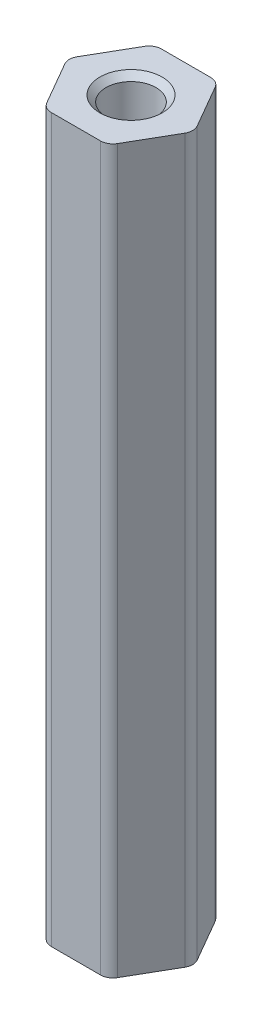
ISO-10303-21;
HEADER;
FILE_DESCRIPTION(('STEP AP214'),'2;1');
FILE_NAME('part.step','',(''),(''),'','','');
FILE_SCHEMA(('AUTOMOTIVE_DESIGN { 1 0 10303 214 1 1 1 1 }'));
ENDSEC;
DATA;
#1=APPLICATION_CONTEXT('core data for automotive mechanical design processes');
#2=APPLICATION_PROTOCOL_DEFINITION('international standard','automotive_design',2000,#1);
#3=PRODUCT_CONTEXT('',#1,'mechanical');
#4=PRODUCT('Part','Part','',(#3));
#5=PRODUCT_RELATED_PRODUCT_CATEGORY('part','',(#4));
#6=PRODUCT_DEFINITION_FORMATION('','',#4);
#7=PRODUCT_DEFINITION_CONTEXT('part definition',#1,'design');
#8=PRODUCT_DEFINITION('design','',#6,#7);
#9=PRODUCT_DEFINITION_SHAPE('','',#8);
#10=(LENGTH_UNIT() NAMED_UNIT(*) SI_UNIT(.MILLI.,.METRE.));
#11=(NAMED_UNIT(*) PLANE_ANGLE_UNIT() SI_UNIT($,.RADIAN.));
#12=(NAMED_UNIT(*) SI_UNIT($,.STERADIAN.) SOLID_ANGLE_UNIT());
#13=UNCERTAINTY_MEASURE_WITH_UNIT(LENGTH_MEASURE(1.E-05),#10,'distance_accuracy_value','');
#14=(GEOMETRIC_REPRESENTATION_CONTEXT(3) GLOBAL_UNCERTAINTY_ASSIGNED_CONTEXT((#13)) GLOBAL_UNIT_ASSIGNED_CONTEXT((#10,
#11,#12)) REPRESENTATION_CONTEXT('',''));
#15=CARTESIAN_POINT('',(0.,0.,0.));
#16=DIRECTION('',(0.,0.,1.));
#17=DIRECTION('',(1.,0.,0.));
#18=AXIS2_PLACEMENT_3D('',#15,#16,#17);
#19=CARTESIAN_POINT('',(-2.6035,29.591,0.));
#20=DIRECTION('',(-0.866025403784438,0.,-0.500000000000001));
#21=DIRECTION('',(-0.500000000000001,0.,0.866025403784438));
#22=AXIS2_PLACEMENT_3D('',#19,#20,#21);
#23=PLANE('',#22);
#24=DIRECTION('',(0.500000000000001,0.,-0.866025403784438));
#25=VECTOR('',#24,1.);
#26=CARTESIAN_POINT('',(-2.6035,0.,0.));
#27=LINE('',#26,#25);
#28=CARTESIAN_POINT('',(-2.45685303162583,0.,-0.254000000000001));
#29=VERTEX_POINT('',#28);
#30=CARTESIAN_POINT('',(-1.44839696837416,0.,-2.00069713875279));
#31=VERTEX_POINT('',#30);
#32=EDGE_CURVE('E215',#29,#31,#27,.T.);
#33=ORIENTED_EDGE('',*,*,#32,.F.);
#34=DIRECTION('',(0.,-1.,0.));
#35=VECTOR('',#34,1.);
#36=CARTESIAN_POINT('',(-2.45685303162583,29.591,-0.254000000000001));
#37=LINE('',#36,#35);
#38=CARTESIAN_POINT('',(-2.45685303162583,29.591,-0.254000000000001));
#39=VERTEX_POINT('',#38);
#40=EDGE_CURVE('E170',#29,#39,#37,.F.);
#41=ORIENTED_EDGE('',*,*,#40,.T.);
#42=DIRECTION('',(0.500000000000001,0.,-0.866025403784438));
#43=VECTOR('',#42,1.);
#44=CARTESIAN_POINT('',(-2.6035,29.591,0.));
#45=LINE('',#44,#43);
#46=CARTESIAN_POINT('',(-1.44839696837416,29.591,-2.00069713875279));
#47=VERTEX_POINT('',#46);
#48=EDGE_CURVE('E147',#39,#47,#45,.T.);
#49=ORIENTED_EDGE('',*,*,#48,.T.);
#50=DIRECTION('',(0.,-1.,0.));
#51=VECTOR('',#50,1.);
#52=CARTESIAN_POINT('',(-1.44839696837416,29.591,-2.00069713875279));
#53=LINE('',#52,#51);
#54=EDGE_CURVE('E167',#47,#31,#53,.T.);
#55=ORIENTED_EDGE('',*,*,#54,.T.);
#56=EDGE_LOOP('',(#33,#41,#49,#55));
#57=FACE_BOUND('',#56,.T.);
#58=ADVANCED_FACE('F36',(#57),#23,.T.);
#59=CARTESIAN_POINT('',(-1.30174999999999,29.591,2.25469713875279));
#60=DIRECTION('',(-0.866025403784438,0.,0.500000000000001));
#61=DIRECTION('',(0.500000000000001,0.,0.866025403784438));
#62=AXIS2_PLACEMENT_3D('',#59,#60,#61);
#63=PLANE('',#62);
#64=DIRECTION('',(-0.500000000000001,0.,-0.866025403784438));
#65=VECTOR('',#64,1.);
#66=CARTESIAN_POINT('',(-1.30174999999999,29.591,2.25469713875279));
#67=LINE('',#66,#65);
#68=CARTESIAN_POINT('',(-1.44839696837416,29.591,2.00069713875279));
#69=VERTEX_POINT('',#68);
#70=CARTESIAN_POINT('',(-2.45685303162583,29.591,0.254));
#71=VERTEX_POINT('',#70);
#72=EDGE_CURVE('E152',#69,#71,#67,.T.);
#73=ORIENTED_EDGE('',*,*,#72,.T.);
#74=DIRECTION('',(0.,-1.,0.));
#75=VECTOR('',#74,1.);
#76=CARTESIAN_POINT('',(-2.45685303162583,29.591,0.254));
#77=LINE('',#76,#75);
#78=CARTESIAN_POINT('',(-2.45685303162583,0.,0.254));
#79=VERTEX_POINT('',#78);
#80=EDGE_CURVE('E146',#71,#79,#77,.T.);
#81=ORIENTED_EDGE('',*,*,#80,.T.);
#82=DIRECTION('',(-0.500000000000001,0.,-0.866025403784438));
#83=VECTOR('',#82,1.);
#84=CARTESIAN_POINT('',(-1.30174999999999,0.,2.25469713875279));
#85=LINE('',#84,#83);
#86=CARTESIAN_POINT('',(-1.44839696837416,0.,2.00069713875279));
#87=VERTEX_POINT('',#86);
#88=EDGE_CURVE('E129',#87,#79,#85,.T.);
#89=ORIENTED_EDGE('',*,*,#88,.F.);
#90=DIRECTION('',(0.,-1.,0.));
#91=VECTOR('',#90,1.);
#92=CARTESIAN_POINT('',(-1.44839696837416,29.591,2.00069713875279));
#93=LINE('',#92,#91);
#94=EDGE_CURVE('E143',#87,#69,#93,.F.);
#95=ORIENTED_EDGE('',*,*,#94,.T.);
#96=EDGE_LOOP('',(#73,#81,#89,#95));
#97=FACE_BOUND('',#96,.T.);
#98=ADVANCED_FACE('F142',(#97),#63,.T.);
#99=CARTESIAN_POINT('',(1.30175,29.591,2.25469713875279));
#100=DIRECTION('',(0.,0.,1.));
#101=DIRECTION('',(1.,0.,0.));
#102=AXIS2_PLACEMENT_3D('',#99,#100,#101);
#103=PLANE('',#102);
#104=DIRECTION('',(-1.,0.,0.));
#105=VECTOR('',#104,1.);
#106=CARTESIAN_POINT('',(1.30175,29.591,2.25469713875279));
#107=LINE('',#106,#105);
#108=CARTESIAN_POINT('',(1.00845606325167,29.591,2.25469713875279));
#109=VERTEX_POINT('',#108);
#110=CARTESIAN_POINT('',(-1.00845606325166,29.591,2.25469713875279));
#111=VERTEX_POINT('',#110);
#112=EDGE_CURVE('E156',#109,#111,#107,.T.);
#113=ORIENTED_EDGE('',*,*,#112,.T.);
#114=DIRECTION('',(0.,-1.,0.));
#115=VECTOR('',#114,1.);
#116=CARTESIAN_POINT('',(-1.00845606325166,29.591,2.25469713875279));
#117=LINE('',#116,#115);
#118=CARTESIAN_POINT('',(-1.00845606325166,0.,2.25469713875279));
#119=VERTEX_POINT('',#118);
#120=EDGE_CURVE('E184',#111,#119,#117,.T.);
#121=ORIENTED_EDGE('',*,*,#120,.T.);
#122=DIRECTION('',(-1.,0.,0.));
#123=VECTOR('',#122,1.);
#124=CARTESIAN_POINT('',(1.30175,0.,2.25469713875279));
#125=LINE('',#124,#123);
#126=CARTESIAN_POINT('',(1.00845606325167,0.,2.25469713875279));
#127=VERTEX_POINT('',#126);
#128=EDGE_CURVE('E131',#127,#119,#125,.T.);
#129=ORIENTED_EDGE('',*,*,#128,.F.);
#130=DIRECTION('',(0.,-1.,0.));
#131=VECTOR('',#130,1.);
#132=CARTESIAN_POINT('',(1.00845606325167,29.591,2.25469713875279));
#133=LINE('',#132,#131);
#134=EDGE_CURVE('E182',#127,#109,#133,.F.);
#135=ORIENTED_EDGE('',*,*,#134,.T.);
#136=EDGE_LOOP('',(#113,#121,#129,#135));
#137=FACE_BOUND('',#136,.T.);
#138=ADVANCED_FACE('F269',(#137),#103,.T.);
#139=CARTESIAN_POINT('',(2.6035,29.591,0.));
#140=DIRECTION('',(0.866025403784438,0.,0.500000000000001));
#141=DIRECTION('',(0.500000000000001,0.,-0.866025403784438));
#142=AXIS2_PLACEMENT_3D('',#139,#140,#141);
#143=PLANE('',#142);
#144=DIRECTION('',(-0.500000000000001,0.,0.866025403784438));
#145=VECTOR('',#144,1.);
#146=CARTESIAN_POINT('',(2.6035,0.,0.));
#147=LINE('',#146,#145);
#148=CARTESIAN_POINT('',(2.45685303162583,0.,0.254000000000001));
#149=VERTEX_POINT('',#148);
#150=CARTESIAN_POINT('',(1.44839696837416,0.,2.00069713875279));
#151=VERTEX_POINT('',#150);
#152=EDGE_CURVE('E201',#149,#151,#147,.T.);
#153=ORIENTED_EDGE('',*,*,#152,.F.);
#154=DIRECTION('',(0.,-1.,0.));
#155=VECTOR('',#154,1.);
#156=CARTESIAN_POINT('',(2.45685303162583,29.591,0.254000000000001));
#157=LINE('',#156,#155);
#158=CARTESIAN_POINT('',(2.45685303162583,29.591,0.254000000000001));
#159=VERTEX_POINT('',#158);
#160=EDGE_CURVE('E11',#149,#159,#157,.F.);
#161=ORIENTED_EDGE('',*,*,#160,.T.);
#162=DIRECTION('',(-0.500000000000001,0.,0.866025403784438));
#163=VECTOR('',#162,1.);
#164=CARTESIAN_POINT('',(2.6035,29.591,0.));
#165=LINE('',#164,#163);
#166=CARTESIAN_POINT('',(1.44839696837416,29.591,2.00069713875279));
#167=VERTEX_POINT('',#166);
#168=EDGE_CURVE('E204',#159,#167,#165,.T.);
#169=ORIENTED_EDGE('',*,*,#168,.T.);
#170=DIRECTION('',(0.,-1.,0.));
#171=VECTOR('',#170,1.);
#172=CARTESIAN_POINT('',(1.44839696837416,29.591,2.00069713875279));
#173=LINE('',#172,#171);
#174=EDGE_CURVE('E44',#167,#151,#173,.T.);
#175=ORIENTED_EDGE('',*,*,#174,.T.);
#176=EDGE_LOOP('',(#153,#161,#169,#175));
#177=FACE_BOUND('',#176,.T.);
#178=ADVANCED_FACE('F200',(#177),#143,.T.);
#179=CARTESIAN_POINT('',(1.30174999999999,29.591,-2.25469713875279));
#180=DIRECTION('',(0.866025403784438,0.,-0.500000000000001));
#181=DIRECTION('',(-0.500000000000001,0.,-0.866025403784438));
#182=AXIS2_PLACEMENT_3D('',#179,#180,#181);
#183=PLANE('',#182);
#184=DIRECTION('',(0.500000000000001,0.,0.866025403784438));
#185=VECTOR('',#184,1.);
#186=CARTESIAN_POINT('',(1.30174999999999,0.,-2.25469713875279));
#187=LINE('',#186,#185);
#188=CARTESIAN_POINT('',(1.44839696837416,0.,-2.00069713875279));
#189=VERTEX_POINT('',#188);
#190=CARTESIAN_POINT('',(2.45685303162583,0.,-0.254));
#191=VERTEX_POINT('',#190);
#192=EDGE_CURVE('E208',#189,#191,#187,.T.);
#193=ORIENTED_EDGE('',*,*,#192,.F.);
#194=DIRECTION('',(0.,-1.,0.));
#195=VECTOR('',#194,1.);
#196=CARTESIAN_POINT('',(1.44839696837416,29.591,-2.00069713875279));
#197=LINE('',#196,#195);
#198=CARTESIAN_POINT('',(1.44839696837416,29.591,-2.00069713875279));
#199=VERTEX_POINT('',#198);
#200=EDGE_CURVE('E193',#189,#199,#197,.F.);
#201=ORIENTED_EDGE('',*,*,#200,.T.);
#202=DIRECTION('',(0.500000000000001,0.,0.866025403784438));
#203=VECTOR('',#202,1.);
#204=CARTESIAN_POINT('',(1.30174999999999,29.591,-2.25469713875279));
#205=LINE('',#204,#203);
#206=CARTESIAN_POINT('',(2.45685303162583,29.591,-0.254));
#207=VERTEX_POINT('',#206);
#208=EDGE_CURVE('E222',#199,#207,#205,.T.);
#209=ORIENTED_EDGE('',*,*,#208,.T.);
#210=DIRECTION('',(0.,-1.,0.));
#211=VECTOR('',#210,1.);
#212=CARTESIAN_POINT('',(2.45685303162583,29.591,-0.254));
#213=LINE('',#212,#211);
#214=EDGE_CURVE('E190',#207,#191,#213,.T.);
#215=ORIENTED_EDGE('',*,*,#214,.T.);
#216=EDGE_LOOP('',(#193,#201,#209,#215));
#217=FACE_BOUND('',#216,.T.);
#218=ADVANCED_FACE('F261',(#217),#183,.T.);
#219=CARTESIAN_POINT('',(-1.30175,29.591,-2.25469713875279));
#220=DIRECTION('',(0.,0.,-1.));
#221=DIRECTION('',(-1.,0.,0.));
#222=AXIS2_PLACEMENT_3D('',#219,#220,#221);
#223=PLANE('',#222);
#224=DIRECTION('',(1.,0.,0.));
#225=VECTOR('',#224,1.);
#226=CARTESIAN_POINT('',(-1.30175,0.,-2.25469713875279));
#227=LINE('',#226,#225);
#228=CARTESIAN_POINT('',(-1.00845606325167,0.,-2.25469713875279));
#229=VERTEX_POINT('',#228);
#230=CARTESIAN_POINT('',(1.00845606325166,0.,-2.25469713875279));
#231=VERTEX_POINT('',#230);
#232=EDGE_CURVE('E210',#229,#231,#227,.T.);
#233=ORIENTED_EDGE('',*,*,#232,.F.);
#234=DIRECTION('',(0.,-1.,0.));
#235=VECTOR('',#234,1.);
#236=CARTESIAN_POINT('',(-1.00845606325167,29.591,-2.25469713875279));
#237=LINE('',#236,#235);
#238=CARTESIAN_POINT('',(-1.00845606325167,29.591,-2.25469713875279));
#239=VERTEX_POINT('',#238);
#240=EDGE_CURVE('E58',#229,#239,#237,.F.);
#241=ORIENTED_EDGE('',*,*,#240,.T.);
#242=DIRECTION('',(1.,0.,0.));
#243=VECTOR('',#242,1.);
#244=CARTESIAN_POINT('',(-1.30175,29.591,-2.25469713875279));
#245=LINE('',#244,#243);
#246=CARTESIAN_POINT('',(1.00845606325166,29.591,-2.25469713875279));
#247=VERTEX_POINT('',#246);
#248=EDGE_CURVE('E225',#239,#247,#245,.T.);
#249=ORIENTED_EDGE('',*,*,#248,.T.);
#250=DIRECTION('',(0.,-1.,0.));
#251=VECTOR('',#250,1.);
#252=CARTESIAN_POINT('',(1.00845606325166,29.591,-2.25469713875279));
#253=LINE('',#252,#251);
#254=EDGE_CURVE('E186',#247,#231,#253,.T.);
#255=ORIENTED_EDGE('',*,*,#254,.T.);
#256=EDGE_LOOP('',(#233,#241,#249,#255));
#257=FACE_BOUND('',#256,.T.);
#258=ADVANCED_FACE('F242',(#257),#223,.T.);
#259=CARTESIAN_POINT('',(0.,29.591,0.));
#260=DIRECTION('',(0.,-1.,0.));
#261=DIRECTION('',(0.,0.,-1.));
#262=AXIS2_PLACEMENT_3D('',#259,#260,#261);
#263=PLANE('',#262);
#264=CARTESIAN_POINT('',(0.,29.591,0.));
#265=DIRECTION('',(0.,1.,0.));
#266=DIRECTION('',(0.,0.,1.));
#267=AXIS2_PLACEMENT_3D('',#264,#265,#266);
#268=CIRCLE('',#267,1.275);
#269=CARTESIAN_POINT('',(0.,29.591,1.275));
#270=VERTEX_POINT('',#269);
#271=EDGE_CURVE('E234',#270,#270,#268,.T.);
#272=ORIENTED_EDGE('',*,*,#271,.F.);
#273=EDGE_LOOP('',(#272));
#274=FACE_BOUND('',#273,.T.);
#275=ORIENTED_EDGE('',*,*,#48,.F.);
#276=CARTESIAN_POINT('',(-2.01691212650334,29.591,0.));
#277=DIRECTION('',(0.,-1.,0.));
#278=DIRECTION('',(0.,0.,-1.));
#279=AXIS2_PLACEMENT_3D('',#276,#277,#278);
#280=CIRCLE('',#279,0.508);
#281=EDGE_CURVE('E180',#39,#71,#280,.F.);
#282=ORIENTED_EDGE('',*,*,#281,.T.);
#283=ORIENTED_EDGE('',*,*,#72,.F.);
#284=CARTESIAN_POINT('',(-1.00845606325166,29.591,1.74669713875279));
#285=DIRECTION('',(0.,-1.,0.));
#286=DIRECTION('',(0.,0.,-1.));
#287=AXIS2_PLACEMENT_3D('',#284,#285,#286);
#288=CIRCLE('',#287,0.508);
#289=EDGE_CURVE('E151',#69,#111,#288,.F.);
#290=ORIENTED_EDGE('',*,*,#289,.T.);
#291=ORIENTED_EDGE('',*,*,#112,.F.);
#292=CARTESIAN_POINT('',(1.00845606325167,29.591,1.74669713875279));
#293=DIRECTION('',(0.,-1.,0.));
#294=DIRECTION('',(0.,0.,-1.));
#295=AXIS2_PLACEMENT_3D('',#292,#293,#294);
#296=CIRCLE('',#295,0.508);
#297=EDGE_CURVE('E172',#109,#167,#296,.F.);
#298=ORIENTED_EDGE('',*,*,#297,.T.);
#299=ORIENTED_EDGE('',*,*,#168,.F.);
#300=CARTESIAN_POINT('',(2.01691212650334,29.591,0.));
#301=DIRECTION('',(0.,-1.,0.));
#302=DIRECTION('',(0.,0.,-1.));
#303=AXIS2_PLACEMENT_3D('',#300,#301,#302);
#304=CIRCLE('',#303,0.508);
#305=EDGE_CURVE('E174',#159,#207,#304,.F.);
#306=ORIENTED_EDGE('',*,*,#305,.T.);
#307=ORIENTED_EDGE('',*,*,#208,.F.);
#308=CARTESIAN_POINT('',(1.00845606325166,29.591,-1.74669713875279));
#309=DIRECTION('',(0.,-1.,0.));
#310=DIRECTION('',(0.,0.,-1.));
#311=AXIS2_PLACEMENT_3D('',#308,#309,#310);
#312=CIRCLE('',#311,0.508);
#313=EDGE_CURVE('E51',#199,#247,#312,.F.);
#314=ORIENTED_EDGE('',*,*,#313,.T.);
#315=ORIENTED_EDGE('',*,*,#248,.F.);
#316=CARTESIAN_POINT('',(-1.00845606325167,29.591,-1.74669713875279));
#317=DIRECTION('',(0.,-1.,0.));
#318=DIRECTION('',(0.,0.,-1.));
#319=AXIS2_PLACEMENT_3D('',#316,#317,#318);
#320=CIRCLE('',#319,0.508);
#321=EDGE_CURVE('E177',#239,#47,#320,.F.);
#322=ORIENTED_EDGE('',*,*,#321,.T.);
#323=EDGE_LOOP('',(#275,#282,#283,#290,#291,#298,#299,#306,#307,#314,#315,#322));
#324=FACE_BOUND('',#323,.T.);
#325=ADVANCED_FACE('F240',(#274,#324),#263,.F.);
#326=CARTESIAN_POINT('',(0.,0.,0.));
#327=DIRECTION('',(0.,-1.,0.));
#328=DIRECTION('',(0.,0.,-1.));
#329=AXIS2_PLACEMENT_3D('',#326,#327,#328);
#330=PLANE('',#329);
#331=CARTESIAN_POINT('',(0.,0.,0.));
#332=DIRECTION('',(0.,1.,0.));
#333=DIRECTION('',(0.,0.,1.));
#334=AXIS2_PLACEMENT_3D('',#331,#332,#333);
#335=CIRCLE('',#334,1.02499999999999);
#336=CARTESIAN_POINT('',(0.,0.,1.02499999999999));
#337=VERTEX_POINT('',#336);
#338=EDGE_CURVE('E217',#337,#337,#335,.T.);
#339=ORIENTED_EDGE('',*,*,#338,.T.);
#340=EDGE_LOOP('',(#339));
#341=FACE_BOUND('',#340,.T.);
#342=ORIENTED_EDGE('',*,*,#88,.T.);
#343=CARTESIAN_POINT('',(-2.01691212650334,0.,0.));
#344=DIRECTION('',(0.,-1.,0.));
#345=DIRECTION('',(0.,0.,-1.));
#346=AXIS2_PLACEMENT_3D('',#343,#344,#345);
#347=CIRCLE('',#346,0.508);
#348=EDGE_CURVE('E136',#79,#29,#347,.T.);
#349=ORIENTED_EDGE('',*,*,#348,.T.);
#350=ORIENTED_EDGE('',*,*,#32,.T.);
#351=CARTESIAN_POINT('',(-1.00845606325167,0.,-1.74669713875279));
#352=DIRECTION('',(0.,-1.,0.));
#353=DIRECTION('',(0.,0.,-1.));
#354=AXIS2_PLACEMENT_3D('',#351,#352,#353);
#355=CIRCLE('',#354,0.508);
#356=EDGE_CURVE('E137',#31,#229,#355,.T.);
#357=ORIENTED_EDGE('',*,*,#356,.T.);
#358=ORIENTED_EDGE('',*,*,#232,.T.);
#359=CARTESIAN_POINT('',(1.00845606325166,0.,-1.74669713875279));
#360=DIRECTION('',(0.,-1.,0.));
#361=DIRECTION('',(0.,0.,-1.));
#362=AXIS2_PLACEMENT_3D('',#359,#360,#361);
#363=CIRCLE('',#362,0.508);
#364=EDGE_CURVE('E163',#231,#189,#363,.T.);
#365=ORIENTED_EDGE('',*,*,#364,.T.);
#366=ORIENTED_EDGE('',*,*,#192,.T.);
#367=CARTESIAN_POINT('',(2.01691212650334,0.,0.));
#368=DIRECTION('',(0.,-1.,0.));
#369=DIRECTION('',(0.,0.,-1.));
#370=AXIS2_PLACEMENT_3D('',#367,#368,#369);
#371=CIRCLE('',#370,0.508);
#372=EDGE_CURVE('E161',#191,#149,#371,.T.);
#373=ORIENTED_EDGE('',*,*,#372,.T.);
#374=ORIENTED_EDGE('',*,*,#152,.T.);
#375=CARTESIAN_POINT('',(1.00845606325167,0.,1.74669713875279));
#376=DIRECTION('',(0.,-1.,0.));
#377=DIRECTION('',(0.,0.,-1.));
#378=AXIS2_PLACEMENT_3D('',#375,#376,#377);
#379=CIRCLE('',#378,0.508);
#380=EDGE_CURVE('E154',#151,#127,#379,.T.);
#381=ORIENTED_EDGE('',*,*,#380,.T.);
#382=ORIENTED_EDGE('',*,*,#128,.T.);
#383=CARTESIAN_POINT('',(-1.00845606325166,0.,1.74669713875279));
#384=DIRECTION('',(0.,-1.,0.));
#385=DIRECTION('',(0.,0.,-1.));
#386=AXIS2_PLACEMENT_3D('',#383,#384,#385);
#387=CIRCLE('',#386,0.508);
#388=EDGE_CURVE('E126',#119,#87,#387,.T.);
#389=ORIENTED_EDGE('',*,*,#388,.T.);
#390=EDGE_LOOP('',(#342,#349,#350,#357,#358,#365,#366,#373,#374,#381,#382,#389));
#391=FACE_BOUND('',#390,.T.);
#392=ADVANCED_FACE('F128',(#341,#391),#330,.T.);
#393=CARTESIAN_POINT('',(-2.01691212650334,29.591,0.));
#394=DIRECTION('',(0.,-1.,0.));
#395=DIRECTION('',(0.,0.,-1.));
#396=AXIS2_PLACEMENT_3D('',#393,#394,#395);
#397=CYLINDRICAL_SURFACE('',#396,0.508);
#398=ORIENTED_EDGE('',*,*,#281,.F.);
#399=ORIENTED_EDGE('',*,*,#40,.F.);
#400=ORIENTED_EDGE('',*,*,#348,.F.);
#401=ORIENTED_EDGE('',*,*,#80,.F.);
#402=EDGE_LOOP('',(#398,#399,#400,#401));
#403=FACE_BOUND('',#402,.T.);
#404=ADVANCED_FACE('F251',(#403),#397,.T.);
#405=CARTESIAN_POINT('',(-1.00845606325166,29.591,1.74669713875279));
#406=DIRECTION('',(0.,-1.,0.));
#407=DIRECTION('',(0.,0.,-1.));
#408=AXIS2_PLACEMENT_3D('',#405,#406,#407);
#409=CYLINDRICAL_SURFACE('',#408,0.508);
#410=ORIENTED_EDGE('',*,*,#289,.F.);
#411=ORIENTED_EDGE('',*,*,#94,.F.);
#412=ORIENTED_EDGE('',*,*,#388,.F.);
#413=ORIENTED_EDGE('',*,*,#120,.F.);
#414=EDGE_LOOP('',(#410,#411,#412,#413));
#415=FACE_BOUND('',#414,.T.);
#416=ADVANCED_FACE('F150',(#415),#409,.T.);
#417=CARTESIAN_POINT('',(-1.00845606325167,29.591,-1.74669713875279));
#418=DIRECTION('',(0.,-1.,0.));
#419=DIRECTION('',(0.,0.,-1.));
#420=AXIS2_PLACEMENT_3D('',#417,#418,#419);
#421=CYLINDRICAL_SURFACE('',#420,0.508);
#422=ORIENTED_EDGE('',*,*,#321,.F.);
#423=ORIENTED_EDGE('',*,*,#240,.F.);
#424=ORIENTED_EDGE('',*,*,#356,.F.);
#425=ORIENTED_EDGE('',*,*,#54,.F.);
#426=EDGE_LOOP('',(#422,#423,#424,#425));
#427=FACE_BOUND('',#426,.T.);
#428=ADVANCED_FACE('F254',(#427),#421,.T.);
#429=CARTESIAN_POINT('',(1.00845606325166,29.591,-1.74669713875279));
#430=DIRECTION('',(0.,-1.,0.));
#431=DIRECTION('',(0.,0.,-1.));
#432=AXIS2_PLACEMENT_3D('',#429,#430,#431);
#433=CYLINDRICAL_SURFACE('',#432,0.508);
#434=ORIENTED_EDGE('',*,*,#313,.F.);
#435=ORIENTED_EDGE('',*,*,#200,.F.);
#436=ORIENTED_EDGE('',*,*,#364,.F.);
#437=ORIENTED_EDGE('',*,*,#254,.F.);
#438=EDGE_LOOP('',(#434,#435,#436,#437));
#439=FACE_BOUND('',#438,.T.);
#440=ADVANCED_FACE('F257',(#439),#433,.T.);
#441=CARTESIAN_POINT('',(2.01691212650334,29.591,0.));
#442=DIRECTION('',(0.,-1.,0.));
#443=DIRECTION('',(0.,0.,-1.));
#444=AXIS2_PLACEMENT_3D('',#441,#442,#443);
#445=CYLINDRICAL_SURFACE('',#444,0.508);
#446=ORIENTED_EDGE('',*,*,#305,.F.);
#447=ORIENTED_EDGE('',*,*,#160,.F.);
#448=ORIENTED_EDGE('',*,*,#372,.F.);
#449=ORIENTED_EDGE('',*,*,#214,.F.);
#450=EDGE_LOOP('',(#446,#447,#448,#449));
#451=FACE_BOUND('',#450,.T.);
#452=ADVANCED_FACE('F265',(#451),#445,.T.);
#453=CARTESIAN_POINT('',(1.00845606325167,29.591,1.74669713875279));
#454=DIRECTION('',(0.,-1.,0.));
#455=DIRECTION('',(0.,0.,-1.));
#456=AXIS2_PLACEMENT_3D('',#453,#454,#455);
#457=CYLINDRICAL_SURFACE('',#456,0.508);
#458=ORIENTED_EDGE('',*,*,#297,.F.);
#459=ORIENTED_EDGE('',*,*,#134,.F.);
#460=ORIENTED_EDGE('',*,*,#380,.F.);
#461=ORIENTED_EDGE('',*,*,#174,.F.);
#462=EDGE_LOOP('',(#458,#459,#460,#461));
#463=FACE_BOUND('',#462,.T.);
#464=ADVANCED_FACE('F38',(#463),#457,.T.);
#465=CARTESIAN_POINT('',(0.,29.591,0.));
#466=DIRECTION('',(0.,1.,0.));
#467=DIRECTION('',(0.,0.,1.));
#468=AXIS2_PLACEMENT_3D('',#465,#466,#467);
#469=CYLINDRICAL_SURFACE('',#468,1.02499999999999);
#470=ORIENTED_EDGE('',*,*,#338,.F.);
#471=EDGE_LOOP('',(#470));
#472=FACE_BOUND('',#471,.T.);
#473=CARTESIAN_POINT('',(0.,29.341,0.));
#474=DIRECTION('',(0.,1.,0.));
#475=DIRECTION('',(0.,0.,1.));
#476=AXIS2_PLACEMENT_3D('',#473,#474,#475);
#477=CIRCLE('',#476,1.02499999999999);
#478=CARTESIAN_POINT('',(0.,29.341,1.02499999999999));
#479=VERTEX_POINT('',#478);
#480=EDGE_CURVE('E231',#479,#479,#477,.T.);
#481=ORIENTED_EDGE('',*,*,#480,.T.);
#482=EDGE_LOOP('',(#481));
#483=FACE_BOUND('',#482,.T.);
#484=ADVANCED_FACE('F296',(#472,#483),#469,.F.);
#485=CARTESIAN_POINT('',(0.,29.591,0.));
#486=DIRECTION('',(0.,1.,0.));
#487=DIRECTION('',(0.,0.,1.));
#488=AXIS2_PLACEMENT_3D('',#485,#486,#487);
#489=CONICAL_SURFACE('',#488,1.275,0.785398163397461);
#490=ORIENTED_EDGE('',*,*,#480,.F.);
#491=EDGE_LOOP('',(#490));
#492=FACE_BOUND('',#491,.T.);
#493=ORIENTED_EDGE('',*,*,#271,.T.);
#494=EDGE_LOOP('',(#493));
#495=FACE_BOUND('',#494,.T.);
#496=ADVANCED_FACE('F238',(#492,#495),#489,.F.);
#497=CLOSED_SHELL('',(#58,#98,#138,#178,#218,#258,#325,#392,#404,#416,#428,#440,#452,#464,#484,#496));
#498=MANIFOLD_SOLID_BREP('B2',#497);
#499=ADVANCED_BREP_SHAPE_REPRESENTATION('',(#18,#498),#14);
#500=SHAPE_DEFINITION_REPRESENTATION(#9,#499);
ENDSEC;
END-ISO-10303-21;
